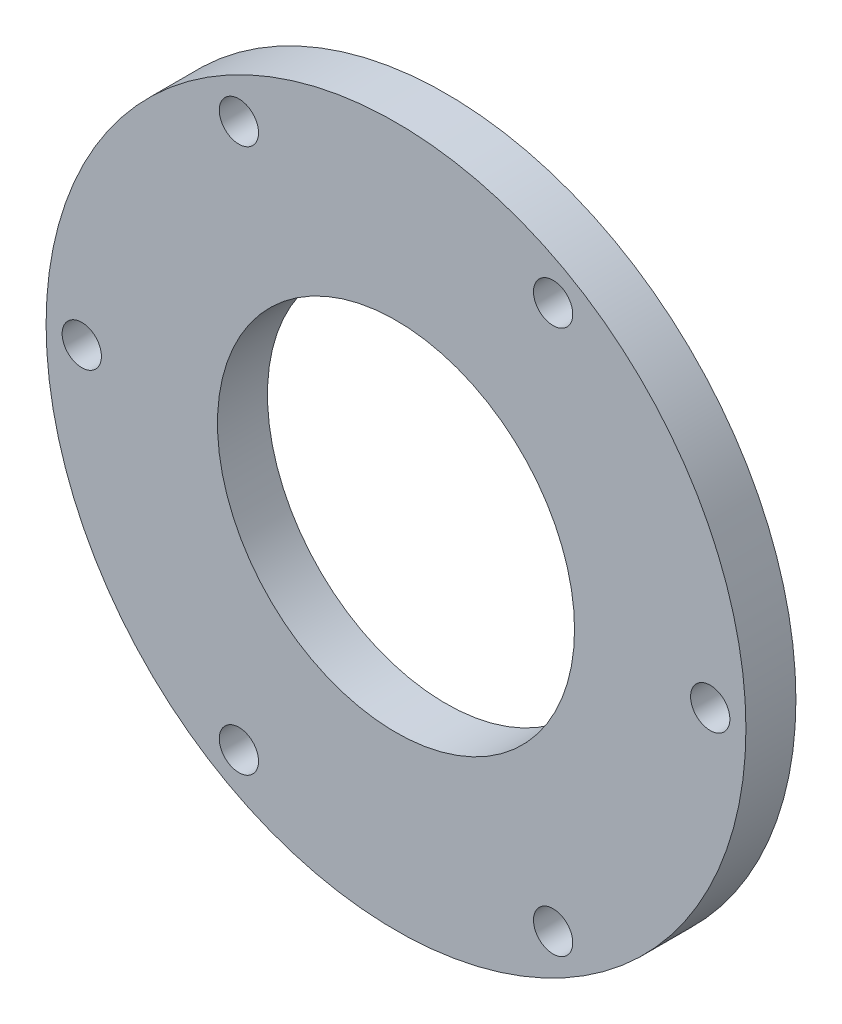
ISO-10303-21;
HEADER;
FILE_DESCRIPTION(('STEP AP214'),'2;1');
FILE_NAME('part.step','',(''),(''),'','','');
FILE_SCHEMA(('AUTOMOTIVE_DESIGN { 1 0 10303 214 1 1 1 1 }'));
ENDSEC;
DATA;
#1=APPLICATION_CONTEXT('core data for automotive mechanical design processes');
#2=APPLICATION_PROTOCOL_DEFINITION('international standard','automotive_design',2000,#1);
#3=PRODUCT_CONTEXT('',#1,'mechanical');
#4=PRODUCT('Part','Part','',(#3));
#5=PRODUCT_RELATED_PRODUCT_CATEGORY('part','',(#4));
#6=PRODUCT_DEFINITION_FORMATION('','',#4);
#7=PRODUCT_DEFINITION_CONTEXT('part definition',#1,'design');
#8=PRODUCT_DEFINITION('design','',#6,#7);
#9=PRODUCT_DEFINITION_SHAPE('','',#8);
#10=(LENGTH_UNIT() NAMED_UNIT(*) SI_UNIT(.MILLI.,.METRE.));
#11=(NAMED_UNIT(*) PLANE_ANGLE_UNIT() SI_UNIT($,.RADIAN.));
#12=(NAMED_UNIT(*) SI_UNIT($,.STERADIAN.) SOLID_ANGLE_UNIT());
#13=UNCERTAINTY_MEASURE_WITH_UNIT(LENGTH_MEASURE(1.E-05),#10,'distance_accuracy_value','');
#14=(GEOMETRIC_REPRESENTATION_CONTEXT(3) GLOBAL_UNCERTAINTY_ASSIGNED_CONTEXT((#13)) GLOBAL_UNIT_ASSIGNED_CONTEXT((#10,
#11,#12)) REPRESENTATION_CONTEXT('',''));
#15=CARTESIAN_POINT('',(0.,0.,0.));
#16=DIRECTION('',(0.,0.,1.));
#17=DIRECTION('',(1.,0.,0.));
#18=AXIS2_PLACEMENT_3D('',#15,#16,#17);
#19=CARTESIAN_POINT('',(0.,0.,7.));
#20=DIRECTION('',(0.,0.,1.));
#21=DIRECTION('',(1.,0.,0.));
#22=AXIS2_PLACEMENT_3D('',#19,#20,#21);
#23=PLANE('',#22);
#24=CARTESIAN_POINT('',(-22.0000000000004,38.105117766515,7.));
#25=DIRECTION('',(0.,0.,-1.));
#26=DIRECTION('',(-1.,0.,0.));
#27=AXIS2_PLACEMENT_3D('',#24,#25,#26);
#28=CIRCLE('',#27,2.75);
#29=CARTESIAN_POINT('',(-24.7500000000004,38.105117766515,7.));
#30=VERTEX_POINT('',#29);
#31=EDGE_CURVE('E99',#30,#30,#28,.T.);
#32=ORIENTED_EDGE('',*,*,#31,.T.);
#33=EDGE_LOOP('',(#32));
#34=FACE_BOUND('',#33,.T.);
#35=CARTESIAN_POINT('',(21.9999999999996,38.1051177665155,7.));
#36=DIRECTION('',(0.,0.,-1.));
#37=DIRECTION('',(-1.,0.,0.));
#38=AXIS2_PLACEMENT_3D('',#35,#36,#37);
#39=CIRCLE('',#38,2.75);
#40=CARTESIAN_POINT('',(19.2499999999996,38.1051177665155,7.));
#41=VERTEX_POINT('',#40);
#42=EDGE_CURVE('E93',#41,#41,#39,.T.);
#43=ORIENTED_EDGE('',*,*,#42,.T.);
#44=EDGE_LOOP('',(#43));
#45=FACE_BOUND('',#44,.T.);
#46=CARTESIAN_POINT('',(44.,0.,7.));
#47=DIRECTION('',(0.,0.,-1.));
#48=DIRECTION('',(-1.,0.,0.));
#49=AXIS2_PLACEMENT_3D('',#46,#47,#48);
#50=CIRCLE('',#49,2.75);
#51=CARTESIAN_POINT('',(41.25,0.,7.));
#52=VERTEX_POINT('',#51);
#53=EDGE_CURVE('E85',#52,#52,#50,.T.);
#54=ORIENTED_EDGE('',*,*,#53,.T.);
#55=EDGE_LOOP('',(#54));
#56=FACE_BOUND('',#55,.T.);
#57=CARTESIAN_POINT('',(22.0000000000002,-38.1051177665152,7.));
#58=DIRECTION('',(0.,0.,-1.));
#59=DIRECTION('',(-1.,0.,0.));
#60=AXIS2_PLACEMENT_3D('',#57,#58,#59);
#61=CIRCLE('',#60,2.75);
#62=CARTESIAN_POINT('',(19.2500000000002,-38.1051177665152,7.));
#63=VERTEX_POINT('',#62);
#64=EDGE_CURVE('E71',#63,#63,#61,.T.);
#65=ORIENTED_EDGE('',*,*,#64,.T.);
#66=EDGE_LOOP('',(#65));
#67=FACE_BOUND('',#66,.T.);
#68=CARTESIAN_POINT('',(-21.9999999999999,-38.1051177665153,7.));
#69=DIRECTION('',(0.,0.,-1.));
#70=DIRECTION('',(-1.,0.,0.));
#71=AXIS2_PLACEMENT_3D('',#68,#69,#70);
#72=CIRCLE('',#71,2.75);
#73=CARTESIAN_POINT('',(-24.7499999999999,-38.1051177665153,7.));
#74=VERTEX_POINT('',#73);
#75=EDGE_CURVE('E63',#74,#74,#72,.T.);
#76=ORIENTED_EDGE('',*,*,#75,.T.);
#77=EDGE_LOOP('',(#76));
#78=FACE_BOUND('',#77,.T.);
#79=CARTESIAN_POINT('',(-44.,0.,7.));
#80=DIRECTION('',(0.,0.,-1.));
#81=DIRECTION('',(-1.,0.,0.));
#82=AXIS2_PLACEMENT_3D('',#79,#80,#81);
#83=CIRCLE('',#82,2.75);
#84=CARTESIAN_POINT('',(-46.75,0.,7.));
#85=VERTEX_POINT('',#84);
#86=EDGE_CURVE('E52',#85,#85,#83,.T.);
#87=ORIENTED_EDGE('',*,*,#86,.T.);
#88=EDGE_LOOP('',(#87));
#89=FACE_BOUND('',#88,.T.);
#90=CARTESIAN_POINT('',(0.,0.,7.));
#91=DIRECTION('',(0.,0.,1.));
#92=DIRECTION('',(1.,0.,0.));
#93=AXIS2_PLACEMENT_3D('',#90,#91,#92);
#94=CIRCLE('',#93,49.);
#95=CARTESIAN_POINT('',(49.,0.,7.));
#96=VERTEX_POINT('',#95);
#97=EDGE_CURVE('E10',#96,#96,#94,.T.);
#98=ORIENTED_EDGE('',*,*,#97,.T.);
#99=EDGE_LOOP('',(#98));
#100=FACE_BOUND('',#99,.T.);
#101=CARTESIAN_POINT('',(0.,0.,7.));
#102=DIRECTION('',(0.,0.,1.));
#103=DIRECTION('',(1.,0.,0.));
#104=AXIS2_PLACEMENT_3D('',#101,#102,#103);
#105=CIRCLE('',#104,25.);
#106=CARTESIAN_POINT('',(25.,0.,7.));
#107=VERTEX_POINT('',#106);
#108=EDGE_CURVE('E48',#107,#107,#105,.T.);
#109=ORIENTED_EDGE('',*,*,#108,.F.);
#110=EDGE_LOOP('',(#109));
#111=FACE_BOUND('',#110,.T.);
#112=ADVANCED_FACE('F40',(#34,#45,#56,#67,#78,#89,#100,#111),#23,.T.);
#113=CARTESIAN_POINT('',(0.,0.,0.));
#114=DIRECTION('',(0.,0.,1.));
#115=DIRECTION('',(1.,0.,0.));
#116=AXIS2_PLACEMENT_3D('',#113,#114,#115);
#117=PLANE('',#116);
#118=CARTESIAN_POINT('',(-23.6,-23.6,0.));
#119=DIRECTION('',(0.,0.,-1.));
#120=DIRECTION('',(-1.,0.,0.));
#121=AXIS2_PLACEMENT_3D('',#118,#119,#120);
#122=CIRCLE('',#121,3.3);
#123=CARTESIAN_POINT('',(-26.9,-23.6,0.));
#124=VERTEX_POINT('',#123);
#125=EDGE_CURVE('E114',#124,#124,#122,.T.);
#126=ORIENTED_EDGE('',*,*,#125,.F.);
#127=EDGE_LOOP('',(#126));
#128=FACE_BOUND('',#127,.T.);
#129=CARTESIAN_POINT('',(23.6,23.6,0.));
#130=DIRECTION('',(0.,0.,-1.));
#131=DIRECTION('',(-1.,0.,0.));
#132=AXIS2_PLACEMENT_3D('',#129,#130,#131);
#133=CIRCLE('',#132,3.3);
#134=CARTESIAN_POINT('',(20.3,23.6,0.));
#135=VERTEX_POINT('',#134);
#136=EDGE_CURVE('E118',#135,#135,#133,.T.);
#137=ORIENTED_EDGE('',*,*,#136,.F.);
#138=EDGE_LOOP('',(#137));
#139=FACE_BOUND('',#138,.T.);
#140=CARTESIAN_POINT('',(23.6,-23.6,0.));
#141=DIRECTION('',(0.,0.,-1.));
#142=DIRECTION('',(-1.,0.,0.));
#143=AXIS2_PLACEMENT_3D('',#140,#141,#142);
#144=CIRCLE('',#143,3.3);
#145=CARTESIAN_POINT('',(20.3,-23.6,0.));
#146=VERTEX_POINT('',#145);
#147=EDGE_CURVE('E117',#146,#146,#144,.T.);
#148=ORIENTED_EDGE('',*,*,#147,.F.);
#149=EDGE_LOOP('',(#148));
#150=FACE_BOUND('',#149,.T.);
#151=CARTESIAN_POINT('',(-23.6,23.6,0.));
#152=DIRECTION('',(0.,0.,-1.));
#153=DIRECTION('',(-1.,0.,0.));
#154=AXIS2_PLACEMENT_3D('',#151,#152,#153);
#155=CIRCLE('',#154,3.3);
#156=CARTESIAN_POINT('',(-26.9,23.6,0.));
#157=VERTEX_POINT('',#156);
#158=EDGE_CURVE('E109',#157,#157,#155,.T.);
#159=ORIENTED_EDGE('',*,*,#158,.F.);
#160=EDGE_LOOP('',(#159));
#161=FACE_BOUND('',#160,.T.);
#162=CARTESIAN_POINT('',(-22.0000000000004,38.105117766515,0.));
#163=DIRECTION('',(0.,0.,-1.));
#164=DIRECTION('',(-1.,0.,0.));
#165=AXIS2_PLACEMENT_3D('',#162,#163,#164);
#166=CIRCLE('',#165,4.6);
#167=CARTESIAN_POINT('',(-26.6000000000004,38.105117766515,0.));
#168=VERTEX_POINT('',#167);
#169=EDGE_CURVE('E106',#168,#168,#166,.T.);
#170=ORIENTED_EDGE('',*,*,#169,.F.);
#171=EDGE_LOOP('',(#170));
#172=FACE_BOUND('',#171,.T.);
#173=CARTESIAN_POINT('',(21.9999999999996,38.1051177665155,0.));
#174=DIRECTION('',(0.,0.,-1.));
#175=DIRECTION('',(-1.,0.,0.));
#176=AXIS2_PLACEMENT_3D('',#173,#174,#175);
#177=CIRCLE('',#176,4.6);
#178=CARTESIAN_POINT('',(17.3999999999996,38.1051177665155,0.));
#179=VERTEX_POINT('',#178);
#180=EDGE_CURVE('E100',#179,#179,#177,.T.);
#181=ORIENTED_EDGE('',*,*,#180,.F.);
#182=EDGE_LOOP('',(#181));
#183=FACE_BOUND('',#182,.T.);
#184=CARTESIAN_POINT('',(44.,0.,0.));
#185=DIRECTION('',(0.,0.,-1.));
#186=DIRECTION('',(-1.,0.,0.));
#187=AXIS2_PLACEMENT_3D('',#184,#185,#186);
#188=CIRCLE('',#187,4.6);
#189=CARTESIAN_POINT('',(39.4,0.,0.));
#190=VERTEX_POINT('',#189);
#191=EDGE_CURVE('E86',#190,#190,#188,.T.);
#192=ORIENTED_EDGE('',*,*,#191,.F.);
#193=EDGE_LOOP('',(#192));
#194=FACE_BOUND('',#193,.T.);
#195=CARTESIAN_POINT('',(22.0000000000002,-38.1051177665152,0.));
#196=DIRECTION('',(0.,0.,-1.));
#197=DIRECTION('',(-1.,0.,0.));
#198=AXIS2_PLACEMENT_3D('',#195,#196,#197);
#199=CIRCLE('',#198,4.6);
#200=CARTESIAN_POINT('',(17.4000000000002,-38.1051177665152,0.));
#201=VERTEX_POINT('',#200);
#202=EDGE_CURVE('E78',#201,#201,#199,.T.);
#203=ORIENTED_EDGE('',*,*,#202,.F.);
#204=EDGE_LOOP('',(#203));
#205=FACE_BOUND('',#204,.T.);
#206=CARTESIAN_POINT('',(-21.9999999999999,-38.1051177665153,0.));
#207=DIRECTION('',(0.,0.,-1.));
#208=DIRECTION('',(-1.,0.,0.));
#209=AXIS2_PLACEMENT_3D('',#206,#207,#208);
#210=CIRCLE('',#209,4.6);
#211=CARTESIAN_POINT('',(-26.5999999999999,-38.1051177665153,0.));
#212=VERTEX_POINT('',#211);
#213=EDGE_CURVE('E69',#212,#212,#210,.T.);
#214=ORIENTED_EDGE('',*,*,#213,.F.);
#215=EDGE_LOOP('',(#214));
#216=FACE_BOUND('',#215,.T.);
#217=CARTESIAN_POINT('',(-44.,0.,0.));
#218=DIRECTION('',(0.,0.,-1.));
#219=DIRECTION('',(-1.,0.,0.));
#220=AXIS2_PLACEMENT_3D('',#217,#218,#219);
#221=CIRCLE('',#220,4.6);
#222=CARTESIAN_POINT('',(-48.6,0.,0.));
#223=VERTEX_POINT('',#222);
#224=EDGE_CURVE('E64',#223,#223,#221,.T.);
#225=ORIENTED_EDGE('',*,*,#224,.F.);
#226=EDGE_LOOP('',(#225));
#227=FACE_BOUND('',#226,.T.);
#228=CARTESIAN_POINT('',(0.,0.,0.));
#229=DIRECTION('',(0.,0.,1.));
#230=DIRECTION('',(1.,0.,0.));
#231=AXIS2_PLACEMENT_3D('',#228,#229,#230);
#232=CIRCLE('',#231,49.);
#233=CARTESIAN_POINT('',(49.,0.,0.));
#234=VERTEX_POINT('',#233);
#235=EDGE_CURVE('E41',#234,#234,#232,.T.);
#236=ORIENTED_EDGE('',*,*,#235,.F.);
#237=EDGE_LOOP('',(#236));
#238=FACE_BOUND('',#237,.T.);
#239=CARTESIAN_POINT('',(0.,0.,0.));
#240=DIRECTION('',(0.,0.,1.));
#241=DIRECTION('',(1.,0.,0.));
#242=AXIS2_PLACEMENT_3D('',#239,#240,#241);
#243=CIRCLE('',#242,25.);
#244=CARTESIAN_POINT('',(25.,0.,0.));
#245=VERTEX_POINT('',#244);
#246=EDGE_CURVE('E49',#245,#245,#243,.T.);
#247=ORIENTED_EDGE('',*,*,#246,.T.);
#248=EDGE_LOOP('',(#247));
#249=FACE_BOUND('',#248,.T.);
#250=ADVANCED_FACE('F136',(#128,#139,#150,#161,#172,#183,#194,#205,#216,#227,#238,#249),#117,.F.);
#251=CARTESIAN_POINT('',(0.,0.,7.));
#252=DIRECTION('',(0.,0.,-1.));
#253=DIRECTION('',(-1.,0.,0.));
#254=AXIS2_PLACEMENT_3D('',#251,#252,#253);
#255=CYLINDRICAL_SURFACE('',#254,49.);
#256=ORIENTED_EDGE('',*,*,#97,.F.);
#257=EDGE_LOOP('',(#256));
#258=FACE_BOUND('',#257,.T.);
#259=ORIENTED_EDGE('',*,*,#235,.T.);
#260=EDGE_LOOP('',(#259));
#261=FACE_BOUND('',#260,.T.);
#262=ADVANCED_FACE('F39',(#258,#261),#255,.T.);
#263=CARTESIAN_POINT('',(0.,0.,7.));
#264=DIRECTION('',(0.,0.,-1.));
#265=DIRECTION('',(-1.,0.,0.));
#266=AXIS2_PLACEMENT_3D('',#263,#264,#265);
#267=CYLINDRICAL_SURFACE('',#266,25.);
#268=ORIENTED_EDGE('',*,*,#108,.T.);
#269=EDGE_LOOP('',(#268));
#270=FACE_BOUND('',#269,.T.);
#271=ORIENTED_EDGE('',*,*,#246,.F.);
#272=EDGE_LOOP('',(#271));
#273=FACE_BOUND('',#272,.T.);
#274=ADVANCED_FACE('F158',(#270,#273),#267,.F.);
#275=CARTESIAN_POINT('',(-44.,0.,0.));
#276=DIRECTION('',(0.,0.,-1.));
#277=DIRECTION('',(-1.,0.,0.));
#278=AXIS2_PLACEMENT_3D('',#275,#276,#277);
#279=CYLINDRICAL_SURFACE('',#278,2.75);
#280=ORIENTED_EDGE('',*,*,#86,.F.);
#281=EDGE_LOOP('',(#280));
#282=FACE_BOUND('',#281,.T.);
#283=CARTESIAN_POINT('',(-44.,0.,1.85));
#284=DIRECTION('',(0.,0.,-1.));
#285=DIRECTION('',(-1.,0.,0.));
#286=AXIS2_PLACEMENT_3D('',#283,#284,#285);
#287=CIRCLE('',#286,2.75);
#288=CARTESIAN_POINT('',(-46.75,0.,1.85));
#289=VERTEX_POINT('',#288);
#290=EDGE_CURVE('E59',#289,#289,#287,.T.);
#291=ORIENTED_EDGE('',*,*,#290,.T.);
#292=EDGE_LOOP('',(#291));
#293=FACE_BOUND('',#292,.T.);
#294=ADVANCED_FACE('F159',(#282,#293),#279,.F.);
#295=CARTESIAN_POINT('',(-44.,0.,0.));
#296=DIRECTION('',(0.,0.,-1.));
#297=DIRECTION('',(-1.,0.,0.));
#298=AXIS2_PLACEMENT_3D('',#295,#296,#297);
#299=CONICAL_SURFACE('',#298,4.6,0.785398163397449);
#300=ORIENTED_EDGE('',*,*,#290,.F.);
#301=EDGE_LOOP('',(#300));
#302=FACE_BOUND('',#301,.T.);
#303=ORIENTED_EDGE('',*,*,#224,.T.);
#304=EDGE_LOOP('',(#303));
#305=FACE_BOUND('',#304,.T.);
#306=ADVANCED_FACE('F170',(#302,#305),#299,.F.);
#307=CARTESIAN_POINT('',(-21.9999999999999,-38.1051177665153,0.));
#308=DIRECTION('',(0.,0.,-1.));
#309=DIRECTION('',(-1.,0.,0.));
#310=AXIS2_PLACEMENT_3D('',#307,#308,#309);
#311=CYLINDRICAL_SURFACE('',#310,2.75);
#312=ORIENTED_EDGE('',*,*,#75,.F.);
#313=EDGE_LOOP('',(#312));
#314=FACE_BOUND('',#313,.T.);
#315=CARTESIAN_POINT('',(-21.9999999999999,-38.1051177665153,1.85));
#316=DIRECTION('',(0.,0.,-1.));
#317=DIRECTION('',(-1.,0.,0.));
#318=AXIS2_PLACEMENT_3D('',#315,#316,#317);
#319=CIRCLE('',#318,2.75);
#320=CARTESIAN_POINT('',(-24.7499999999999,-38.1051177665153,1.85));
#321=VERTEX_POINT('',#320);
#322=EDGE_CURVE('E70',#321,#321,#319,.T.);
#323=ORIENTED_EDGE('',*,*,#322,.T.);
#324=EDGE_LOOP('',(#323));
#325=FACE_BOUND('',#324,.T.);
#326=ADVANCED_FACE('F194',(#314,#325),#311,.F.);
#327=CARTESIAN_POINT('',(-21.9999999999999,-38.1051177665153,0.));
#328=DIRECTION('',(0.,0.,-1.));
#329=DIRECTION('',(-1.,0.,0.));
#330=AXIS2_PLACEMENT_3D('',#327,#328,#329);
#331=CONICAL_SURFACE('',#330,4.6,0.785398163397448);
#332=ORIENTED_EDGE('',*,*,#322,.F.);
#333=EDGE_LOOP('',(#332));
#334=FACE_BOUND('',#333,.T.);
#335=ORIENTED_EDGE('',*,*,#213,.T.);
#336=EDGE_LOOP('',(#335));
#337=FACE_BOUND('',#336,.T.);
#338=ADVANCED_FACE('F200',(#334,#337),#331,.F.);
#339=CARTESIAN_POINT('',(22.0000000000002,-38.1051177665152,0.));
#340=DIRECTION('',(0.,0.,-1.));
#341=DIRECTION('',(-1.,0.,0.));
#342=AXIS2_PLACEMENT_3D('',#339,#340,#341);
#343=CYLINDRICAL_SURFACE('',#342,2.75);
#344=ORIENTED_EDGE('',*,*,#64,.F.);
#345=EDGE_LOOP('',(#344));
#346=FACE_BOUND('',#345,.T.);
#347=CARTESIAN_POINT('',(22.0000000000002,-38.1051177665152,1.85));
#348=DIRECTION('',(0.,0.,-1.));
#349=DIRECTION('',(-1.,0.,0.));
#350=AXIS2_PLACEMENT_3D('',#347,#348,#349);
#351=CIRCLE('',#350,2.75);
#352=CARTESIAN_POINT('',(19.2500000000002,-38.1051177665152,1.85));
#353=VERTEX_POINT('',#352);
#354=EDGE_CURVE('E79',#353,#353,#351,.T.);
#355=ORIENTED_EDGE('',*,*,#354,.T.);
#356=EDGE_LOOP('',(#355));
#357=FACE_BOUND('',#356,.T.);
#358=ADVANCED_FACE('F202',(#346,#357),#343,.F.);
#359=CARTESIAN_POINT('',(22.0000000000002,-38.1051177665152,0.));
#360=DIRECTION('',(0.,0.,-1.));
#361=DIRECTION('',(-1.,0.,0.));
#362=AXIS2_PLACEMENT_3D('',#359,#360,#361);
#363=CONICAL_SURFACE('',#362,4.6,0.785398163397448);
#364=ORIENTED_EDGE('',*,*,#354,.F.);
#365=EDGE_LOOP('',(#364));
#366=FACE_BOUND('',#365,.T.);
#367=ORIENTED_EDGE('',*,*,#202,.T.);
#368=EDGE_LOOP('',(#367));
#369=FACE_BOUND('',#368,.T.);
#370=ADVANCED_FACE('F207',(#366,#369),#363,.F.);
#371=CARTESIAN_POINT('',(44.,0.,0.));
#372=DIRECTION('',(0.,0.,-1.));
#373=DIRECTION('',(-1.,0.,0.));
#374=AXIS2_PLACEMENT_3D('',#371,#372,#373);
#375=CYLINDRICAL_SURFACE('',#374,2.75);
#376=ORIENTED_EDGE('',*,*,#53,.F.);
#377=EDGE_LOOP('',(#376));
#378=FACE_BOUND('',#377,.T.);
#379=CARTESIAN_POINT('',(44.,0.,1.85));
#380=DIRECTION('',(0.,0.,-1.));
#381=DIRECTION('',(-1.,0.,0.));
#382=AXIS2_PLACEMENT_3D('',#379,#380,#381);
#383=CIRCLE('',#382,2.75);
#384=CARTESIAN_POINT('',(41.25,0.,1.85));
#385=VERTEX_POINT('',#384);
#386=EDGE_CURVE('E84',#385,#385,#383,.T.);
#387=ORIENTED_EDGE('',*,*,#386,.T.);
#388=EDGE_LOOP('',(#387));
#389=FACE_BOUND('',#388,.T.);
#390=ADVANCED_FACE('F213',(#378,#389),#375,.F.);
#391=CARTESIAN_POINT('',(44.,0.,0.));
#392=DIRECTION('',(0.,0.,-1.));
#393=DIRECTION('',(-1.,0.,0.));
#394=AXIS2_PLACEMENT_3D('',#391,#392,#393);
#395=CONICAL_SURFACE('',#394,4.6,0.785398163397449);
#396=ORIENTED_EDGE('',*,*,#386,.F.);
#397=EDGE_LOOP('',(#396));
#398=FACE_BOUND('',#397,.T.);
#399=ORIENTED_EDGE('',*,*,#191,.T.);
#400=EDGE_LOOP('',(#399));
#401=FACE_BOUND('',#400,.T.);
#402=ADVANCED_FACE('F220',(#398,#401),#395,.F.);
#403=CARTESIAN_POINT('',(21.9999999999996,38.1051177665155,0.));
#404=DIRECTION('',(0.,0.,-1.));
#405=DIRECTION('',(-1.,0.,0.));
#406=AXIS2_PLACEMENT_3D('',#403,#404,#405);
#407=CYLINDRICAL_SURFACE('',#406,2.75);
#408=ORIENTED_EDGE('',*,*,#42,.F.);
#409=EDGE_LOOP('',(#408));
#410=FACE_BOUND('',#409,.T.);
#411=CARTESIAN_POINT('',(21.9999999999996,38.1051177665155,1.85));
#412=DIRECTION('',(0.,0.,-1.));
#413=DIRECTION('',(-1.,0.,0.));
#414=AXIS2_PLACEMENT_3D('',#411,#412,#413);
#415=CIRCLE('',#414,2.75);
#416=CARTESIAN_POINT('',(19.2499999999996,38.1051177665155,1.85));
#417=VERTEX_POINT('',#416);
#418=EDGE_CURVE('E94',#417,#417,#415,.T.);
#419=ORIENTED_EDGE('',*,*,#418,.T.);
#420=EDGE_LOOP('',(#419));
#421=FACE_BOUND('',#420,.T.);
#422=ADVANCED_FACE('F222',(#410,#421),#407,.F.);
#423=CARTESIAN_POINT('',(21.9999999999996,38.1051177665155,0.));
#424=DIRECTION('',(0.,0.,-1.));
#425=DIRECTION('',(-1.,0.,0.));
#426=AXIS2_PLACEMENT_3D('',#423,#424,#425);
#427=CONICAL_SURFACE('',#426,4.6,0.785398163397448);
#428=ORIENTED_EDGE('',*,*,#418,.F.);
#429=EDGE_LOOP('',(#428));
#430=FACE_BOUND('',#429,.T.);
#431=ORIENTED_EDGE('',*,*,#180,.T.);
#432=EDGE_LOOP('',(#431));
#433=FACE_BOUND('',#432,.T.);
#434=ADVANCED_FACE('F223',(#430,#433),#427,.F.);
#435=CARTESIAN_POINT('',(-22.0000000000004,38.105117766515,0.));
#436=DIRECTION('',(0.,0.,-1.));
#437=DIRECTION('',(-1.,0.,0.));
#438=AXIS2_PLACEMENT_3D('',#435,#436,#437);
#439=CYLINDRICAL_SURFACE('',#438,2.75);
#440=ORIENTED_EDGE('',*,*,#31,.F.);
#441=EDGE_LOOP('',(#440));
#442=FACE_BOUND('',#441,.T.);
#443=CARTESIAN_POINT('',(-22.0000000000004,38.105117766515,1.85));
#444=DIRECTION('',(0.,0.,-1.));
#445=DIRECTION('',(-1.,0.,0.));
#446=AXIS2_PLACEMENT_3D('',#443,#444,#445);
#447=CIRCLE('',#446,2.75);
#448=CARTESIAN_POINT('',(-24.7500000000004,38.105117766515,1.85));
#449=VERTEX_POINT('',#448);
#450=EDGE_CURVE('E103',#449,#449,#447,.T.);
#451=ORIENTED_EDGE('',*,*,#450,.T.);
#452=EDGE_LOOP('',(#451));
#453=FACE_BOUND('',#452,.T.);
#454=ADVANCED_FACE('F228',(#442,#453),#439,.F.);
#455=CARTESIAN_POINT('',(-22.0000000000004,38.105117766515,0.));
#456=DIRECTION('',(0.,0.,-1.));
#457=DIRECTION('',(-1.,0.,0.));
#458=AXIS2_PLACEMENT_3D('',#455,#456,#457);
#459=CONICAL_SURFACE('',#458,4.6,0.785398163397448);
#460=ORIENTED_EDGE('',*,*,#450,.F.);
#461=EDGE_LOOP('',(#460));
#462=FACE_BOUND('',#461,.T.);
#463=ORIENTED_EDGE('',*,*,#169,.T.);
#464=EDGE_LOOP('',(#463));
#465=FACE_BOUND('',#464,.T.);
#466=ADVANCED_FACE('F232',(#462,#465),#459,.F.);
#467=CARTESIAN_POINT('',(-23.6,23.6,6.));
#468=DIRECTION('',(0.,0.,-1.));
#469=DIRECTION('',(-1.,0.,0.));
#470=AXIS2_PLACEMENT_3D('',#467,#468,#469);
#471=CYLINDRICAL_SURFACE('',#470,3.3);
#472=CARTESIAN_POINT('',(-23.6,23.6,6.));
#473=DIRECTION('',(0.,0.,-1.));
#474=DIRECTION('',(-1.,0.,0.));
#475=AXIS2_PLACEMENT_3D('',#472,#473,#474);
#476=CIRCLE('',#475,3.3);
#477=CARTESIAN_POINT('',(-26.9,23.6,6.));
#478=VERTEX_POINT('',#477);
#479=EDGE_CURVE('E108',#478,#478,#476,.T.);
#480=ORIENTED_EDGE('',*,*,#479,.F.);
#481=EDGE_LOOP('',(#480));
#482=FACE_BOUND('',#481,.T.);
#483=ORIENTED_EDGE('',*,*,#158,.T.);
#484=EDGE_LOOP('',(#483));
#485=FACE_BOUND('',#484,.T.);
#486=ADVANCED_FACE('F240',(#482,#485),#471,.F.);
#487=CARTESIAN_POINT('',(-23.6,23.6,6.));
#488=DIRECTION('',(0.,0.,-1.));
#489=DIRECTION('',(-1.,0.,0.));
#490=AXIS2_PLACEMENT_3D('',#487,#488,#489);
#491=PLANE('',#490);
#492=ORIENTED_EDGE('',*,*,#479,.T.);
#493=EDGE_LOOP('',(#492));
#494=FACE_BOUND('',#493,.T.);
#495=ADVANCED_FACE('F244',(#494),#491,.T.);
#496=CARTESIAN_POINT('',(23.6,-23.6,6.));
#497=DIRECTION('',(0.,0.,-1.));
#498=DIRECTION('',(-1.,0.,0.));
#499=AXIS2_PLACEMENT_3D('',#496,#497,#498);
#500=CYLINDRICAL_SURFACE('',#499,3.3);
#501=CARTESIAN_POINT('',(23.6,-23.6,6.));
#502=DIRECTION('',(0.,0.,-1.));
#503=DIRECTION('',(-1.,0.,0.));
#504=AXIS2_PLACEMENT_3D('',#501,#502,#503);
#505=CIRCLE('',#504,3.3);
#506=CARTESIAN_POINT('',(20.3,-23.6,6.));
#507=VERTEX_POINT('',#506);
#508=EDGE_CURVE('E126',#507,#507,#505,.T.);
#509=ORIENTED_EDGE('',*,*,#508,.F.);
#510=EDGE_LOOP('',(#509));
#511=FACE_BOUND('',#510,.T.);
#512=ORIENTED_EDGE('',*,*,#147,.T.);
#513=EDGE_LOOP('',(#512));
#514=FACE_BOUND('',#513,.T.);
#515=ADVANCED_FACE('F133',(#511,#514),#500,.F.);
#516=CARTESIAN_POINT('',(23.6,-23.6,6.));
#517=DIRECTION('',(0.,0.,-1.));
#518=DIRECTION('',(-1.,0.,0.));
#519=AXIS2_PLACEMENT_3D('',#516,#517,#518);
#520=PLANE('',#519);
#521=ORIENTED_EDGE('',*,*,#508,.T.);
#522=EDGE_LOOP('',(#521));
#523=FACE_BOUND('',#522,.T.);
#524=ADVANCED_FACE('F255',(#523),#520,.T.);
#525=CARTESIAN_POINT('',(23.6,23.6,6.));
#526=DIRECTION('',(0.,0.,-1.));
#527=DIRECTION('',(-1.,0.,0.));
#528=AXIS2_PLACEMENT_3D('',#525,#526,#527);
#529=CYLINDRICAL_SURFACE('',#528,3.3);
#530=CARTESIAN_POINT('',(23.6,23.6,6.));
#531=DIRECTION('',(0.,0.,-1.));
#532=DIRECTION('',(-1.,0.,0.));
#533=AXIS2_PLACEMENT_3D('',#530,#531,#532);
#534=CIRCLE('',#533,3.3);
#535=CARTESIAN_POINT('',(20.3,23.6,6.));
#536=VERTEX_POINT('',#535);
#537=EDGE_CURVE('E119',#536,#536,#534,.T.);
#538=ORIENTED_EDGE('',*,*,#537,.F.);
#539=EDGE_LOOP('',(#538));
#540=FACE_BOUND('',#539,.T.);
#541=ORIENTED_EDGE('',*,*,#136,.T.);
#542=EDGE_LOOP('',(#541));
#543=FACE_BOUND('',#542,.T.);
#544=ADVANCED_FACE('F249',(#540,#543),#529,.F.);
#545=CARTESIAN_POINT('',(23.6,23.6,6.));
#546=DIRECTION('',(0.,0.,-1.));
#547=DIRECTION('',(-1.,0.,0.));
#548=AXIS2_PLACEMENT_3D('',#545,#546,#547);
#549=PLANE('',#548);
#550=ORIENTED_EDGE('',*,*,#537,.T.);
#551=EDGE_LOOP('',(#550));
#552=FACE_BOUND('',#551,.T.);
#553=ADVANCED_FACE('F246',(#552),#549,.T.);
#554=CARTESIAN_POINT('',(-23.6,-23.6,6.));
#555=DIRECTION('',(0.,0.,-1.));
#556=DIRECTION('',(-1.,0.,0.));
#557=AXIS2_PLACEMENT_3D('',#554,#555,#556);
#558=CYLINDRICAL_SURFACE('',#557,3.3);
#559=CARTESIAN_POINT('',(-23.6,-23.6,6.));
#560=DIRECTION('',(0.,0.,-1.));
#561=DIRECTION('',(-1.,0.,0.));
#562=AXIS2_PLACEMENT_3D('',#559,#560,#561);
#563=CIRCLE('',#562,3.3);
#564=CARTESIAN_POINT('',(-26.9,-23.6,6.));
#565=VERTEX_POINT('',#564);
#566=EDGE_CURVE('E122',#565,#565,#563,.T.);
#567=ORIENTED_EDGE('',*,*,#566,.F.);
#568=EDGE_LOOP('',(#567));
#569=FACE_BOUND('',#568,.T.);
#570=ORIENTED_EDGE('',*,*,#125,.T.);
#571=EDGE_LOOP('',(#570));
#572=FACE_BOUND('',#571,.T.);
#573=ADVANCED_FACE('F248',(#569,#572),#558,.F.);
#574=CARTESIAN_POINT('',(-23.6,-23.6,6.));
#575=DIRECTION('',(0.,0.,-1.));
#576=DIRECTION('',(-1.,0.,0.));
#577=AXIS2_PLACEMENT_3D('',#574,#575,#576);
#578=PLANE('',#577);
#579=ORIENTED_EDGE('',*,*,#566,.T.);
#580=EDGE_LOOP('',(#579));
#581=FACE_BOUND('',#580,.T.);
#582=ADVANCED_FACE('F258',(#581),#578,.T.);
#583=CLOSED_SHELL('',(#112,#250,#262,#274,#294,#306,#326,#338,#358,#370,#390,#402,#422,#434,
#454,#466,#486,#495,#515,#524,#544,#553,#573,#582));
#584=MANIFOLD_SOLID_BREP('B2',#583);
#585=ADVANCED_BREP_SHAPE_REPRESENTATION('',(#18,#584),#14);
#586=SHAPE_DEFINITION_REPRESENTATION(#9,#585);
ENDSEC;
END-ISO-10303-21;
